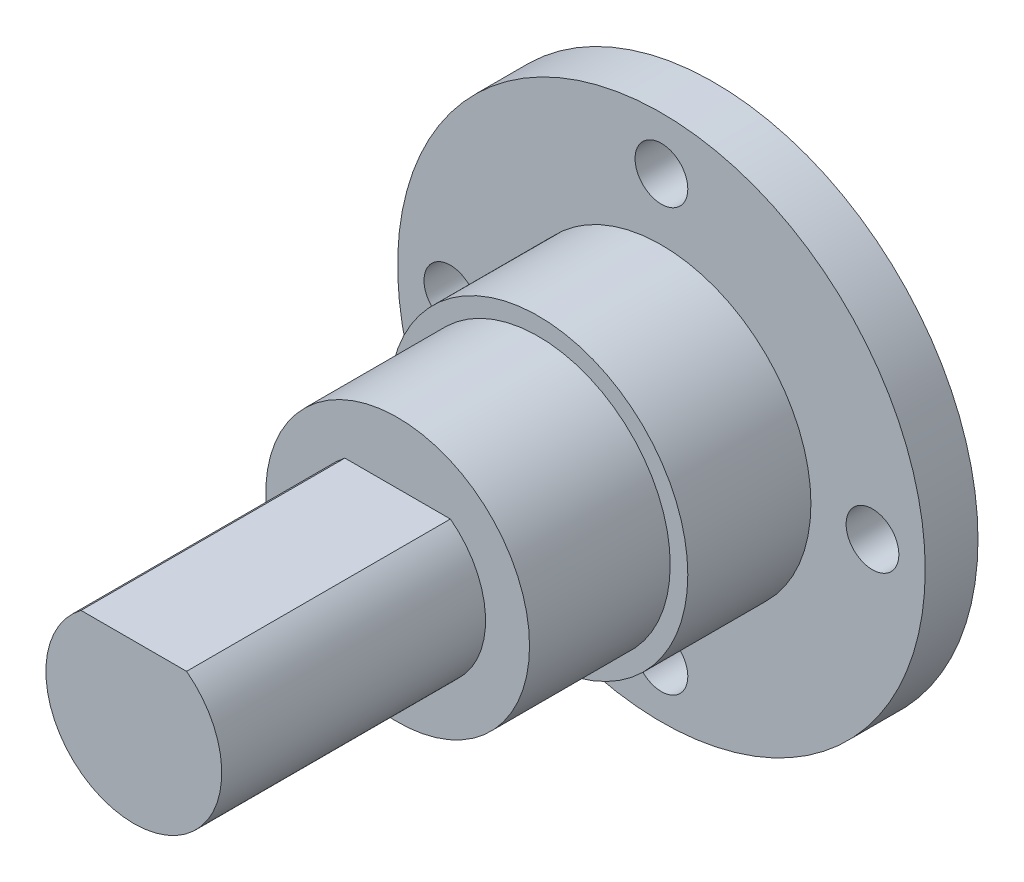
ISO-10303-21;
HEADER;
FILE_DESCRIPTION(('STEP AP214'),'2;1');
FILE_NAME('part.step','',(''),(''),'','','');
FILE_SCHEMA(('AUTOMOTIVE_DESIGN { 1 0 10303 214 1 1 1 1 }'));
ENDSEC;
DATA;
#1=APPLICATION_CONTEXT('core data for automotive mechanical design processes');
#2=APPLICATION_PROTOCOL_DEFINITION('international standard','automotive_design',2000,#1);
#3=PRODUCT_CONTEXT('',#1,'mechanical');
#4=PRODUCT('Part','Part','',(#3));
#5=PRODUCT_RELATED_PRODUCT_CATEGORY('part','',(#4));
#6=PRODUCT_DEFINITION_FORMATION('','',#4);
#7=PRODUCT_DEFINITION_CONTEXT('part definition',#1,'design');
#8=PRODUCT_DEFINITION('design','',#6,#7);
#9=PRODUCT_DEFINITION_SHAPE('','',#8);
#10=(LENGTH_UNIT() NAMED_UNIT(*) SI_UNIT(.MILLI.,.METRE.));
#11=(NAMED_UNIT(*) PLANE_ANGLE_UNIT() SI_UNIT($,.RADIAN.));
#12=(NAMED_UNIT(*) SI_UNIT($,.STERADIAN.) SOLID_ANGLE_UNIT());
#13=UNCERTAINTY_MEASURE_WITH_UNIT(LENGTH_MEASURE(1.E-05),#10,'distance_accuracy_value','');
#14=(GEOMETRIC_REPRESENTATION_CONTEXT(3) GLOBAL_UNCERTAINTY_ASSIGNED_CONTEXT((#13)) GLOBAL_UNIT_ASSIGNED_CONTEXT((#10,
#11,#12)) REPRESENTATION_CONTEXT('',''));
#15=CARTESIAN_POINT('',(0.,0.,0.));
#16=DIRECTION('',(0.,0.,1.));
#17=DIRECTION('',(1.,0.,0.));
#18=AXIS2_PLACEMENT_3D('',#15,#16,#17);
#19=CARTESIAN_POINT('',(0.,0.,18.));
#20=DIRECTION('',(0.,0.,-1.));
#21=DIRECTION('',(-1.,0.,0.));
#22=AXIS2_PLACEMENT_3D('',#19,#20,#21);
#23=CYLINDRICAL_SURFACE('',#22,7.5);
#24=CARTESIAN_POINT('',(0.,0.,10.));
#25=DIRECTION('',(0.,0.,1.));
#26=DIRECTION('',(1.,0.,0.));
#27=AXIS2_PLACEMENT_3D('',#24,#25,#26);
#28=CIRCLE('',#27,7.5);
#29=CARTESIAN_POINT('',(7.5,0.,10.));
#30=VERTEX_POINT('',#29);
#31=EDGE_CURVE('E41',#30,#30,#28,.T.);
#32=ORIENTED_EDGE('',*,*,#31,.T.);
#33=EDGE_LOOP('',(#32));
#34=FACE_BOUND('',#33,.T.);
#35=CARTESIAN_POINT('',(0.,0.,18.));
#36=DIRECTION('',(0.,0.,1.));
#37=DIRECTION('',(1.,0.,0.));
#38=AXIS2_PLACEMENT_3D('',#35,#36,#37);
#39=CIRCLE('',#38,7.5);
#40=CARTESIAN_POINT('',(7.5,0.,18.));
#41=VERTEX_POINT('',#40);
#42=EDGE_CURVE('E85',#41,#41,#39,.T.);
#43=ORIENTED_EDGE('',*,*,#42,.F.);
#44=EDGE_LOOP('',(#43));
#45=FACE_BOUND('',#44,.T.);
#46=ADVANCED_FACE('F37',(#34,#45),#23,.T.);
#47=CARTESIAN_POINT('',(0.,0.,18.));
#48=DIRECTION('',(0.,0.,1.));
#49=DIRECTION('',(1.,0.,0.));
#50=AXIS2_PLACEMENT_3D('',#47,#48,#49);
#51=PLANE('',#50);
#52=CARTESIAN_POINT('',(0.,0.,18.));
#53=DIRECTION('',(0.,0.,1.));
#54=DIRECTION('',(1.,0.,0.));
#55=AXIS2_PLACEMENT_3D('',#52,#53,#54);
#56=CIRCLE('',#55,5.);
#57=CARTESIAN_POINT('',(-3.,4.,18.));
#58=VERTEX_POINT('',#57);
#59=CARTESIAN_POINT('',(3.,4.,18.));
#60=VERTEX_POINT('',#59);
#61=EDGE_CURVE('E80',#58,#60,#56,.T.);
#62=ORIENTED_EDGE('',*,*,#61,.F.);
#63=DIRECTION('',(-1.,0.,0.));
#64=VECTOR('',#63,1.);
#65=CARTESIAN_POINT('',(-3.,4.,18.));
#66=LINE('',#65,#64);
#67=EDGE_CURVE('E53',#60,#58,#66,.T.);
#68=ORIENTED_EDGE('',*,*,#67,.F.);
#69=EDGE_LOOP('',(#62,#68));
#70=FACE_BOUND('',#69,.T.);
#71=ORIENTED_EDGE('',*,*,#42,.T.);
#72=EDGE_LOOP('',(#71));
#73=FACE_BOUND('',#72,.T.);
#74=ADVANCED_FACE('F129',(#70,#73),#51,.T.);
#75=CARTESIAN_POINT('',(0.,0.,33.));
#76=DIRECTION('',(0.,0.,1.));
#77=DIRECTION('',(1.,0.,0.));
#78=AXIS2_PLACEMENT_3D('',#75,#76,#77);
#79=PLANE('',#78);
#80=DIRECTION('',(1.,0.,0.));
#81=VECTOR('',#80,1.);
#82=CARTESIAN_POINT('',(-3.,4.,33.));
#83=LINE('',#82,#81);
#84=CARTESIAN_POINT('',(-3.,4.,33.));
#85=VERTEX_POINT('',#84);
#86=CARTESIAN_POINT('',(3.,4.,33.));
#87=VERTEX_POINT('',#86);
#88=EDGE_CURVE('E66',#85,#87,#83,.T.);
#89=ORIENTED_EDGE('',*,*,#88,.F.);
#90=CARTESIAN_POINT('',(0.,0.,33.));
#91=DIRECTION('',(0.,0.,1.));
#92=DIRECTION('',(1.,0.,0.));
#93=AXIS2_PLACEMENT_3D('',#90,#91,#92);
#94=CIRCLE('',#93,5.);
#95=EDGE_CURVE('E76',#85,#87,#94,.T.);
#96=ORIENTED_EDGE('',*,*,#95,.T.);
#97=EDGE_LOOP('',(#89,#96));
#98=FACE_BOUND('',#97,.T.);
#99=ADVANCED_FACE('F75',(#98),#79,.T.);
#100=CARTESIAN_POINT('',(0.,0.,33.));
#101=DIRECTION('',(0.,0.,-1.));
#102=DIRECTION('',(-1.,0.,0.));
#103=AXIS2_PLACEMENT_3D('',#100,#101,#102);
#104=CYLINDRICAL_SURFACE('',#103,5.);
#105=ORIENTED_EDGE('',*,*,#95,.F.);
#106=DIRECTION('',(0.,0.,1.));
#107=VECTOR('',#106,1.);
#108=CARTESIAN_POINT('',(-3.,4.,11.9172374697018));
#109=LINE('',#108,#107);
#110=EDGE_CURVE('E63',#58,#85,#109,.T.);
#111=ORIENTED_EDGE('',*,*,#110,.F.);
#112=ORIENTED_EDGE('',*,*,#61,.T.);
#113=DIRECTION('',(0.,0.,1.));
#114=VECTOR('',#113,1.);
#115=CARTESIAN_POINT('',(3.,4.,11.9172374697018));
#116=LINE('',#115,#114);
#117=EDGE_CURVE('E71',#60,#87,#116,.T.);
#118=ORIENTED_EDGE('',*,*,#117,.T.);
#119=EDGE_LOOP('',(#105,#111,#112,#118));
#120=FACE_BOUND('',#119,.T.);
#121=ADVANCED_FACE('F78',(#120),#104,.T.);
#122=CARTESIAN_POINT('',(-3.,4.,11.9172374697018));
#123=DIRECTION('',(0.,-1.,0.));
#124=DIRECTION('',(0.,0.,-1.));
#125=AXIS2_PLACEMENT_3D('',#122,#123,#124);
#126=PLANE('',#125);
#127=ORIENTED_EDGE('',*,*,#67,.T.);
#128=ORIENTED_EDGE('',*,*,#110,.T.);
#129=ORIENTED_EDGE('',*,*,#88,.T.);
#130=ORIENTED_EDGE('',*,*,#117,.F.);
#131=EDGE_LOOP('',(#127,#128,#129,#130));
#132=FACE_BOUND('',#131,.T.);
#133=ADVANCED_FACE('F65',(#132),#126,.F.);
#134=CARTESIAN_POINT('',(0.,0.,10.));
#135=DIRECTION('',(0.,0.,-1.));
#136=DIRECTION('',(-1.,0.,0.));
#137=AXIS2_PLACEMENT_3D('',#134,#135,#136);
#138=CYLINDRICAL_SURFACE('',#137,8.5);
#139=CARTESIAN_POINT('',(0.,0.,10.));
#140=DIRECTION('',(0.,0.,1.));
#141=DIRECTION('',(1.,0.,0.));
#142=AXIS2_PLACEMENT_3D('',#139,#140,#141);
#143=CIRCLE('',#142,8.5);
#144=CARTESIAN_POINT('',(8.5,0.,10.));
#145=VERTEX_POINT('',#144);
#146=EDGE_CURVE('E181',#145,#145,#143,.T.);
#147=ORIENTED_EDGE('',*,*,#146,.F.);
#148=EDGE_LOOP('',(#147));
#149=FACE_BOUND('',#148,.T.);
#150=CARTESIAN_POINT('',(0.,0.,3.));
#151=DIRECTION('',(0.,0.,1.));
#152=DIRECTION('',(1.,0.,0.));
#153=AXIS2_PLACEMENT_3D('',#150,#151,#152);
#154=CIRCLE('',#153,8.5);
#155=CARTESIAN_POINT('',(8.5,0.,3.));
#156=VERTEX_POINT('',#155);
#157=EDGE_CURVE('E166',#156,#156,#154,.T.);
#158=ORIENTED_EDGE('',*,*,#157,.T.);
#159=EDGE_LOOP('',(#158));
#160=FACE_BOUND('',#159,.T.);
#161=ADVANCED_FACE('F123',(#149,#160),#138,.T.);
#162=CARTESIAN_POINT('',(0.,0.,10.));
#163=DIRECTION('',(0.,0.,1.));
#164=DIRECTION('',(1.,0.,0.));
#165=AXIS2_PLACEMENT_3D('',#162,#163,#164);
#166=PLANE('',#165);
#167=ORIENTED_EDGE('',*,*,#31,.F.);
#168=EDGE_LOOP('',(#167));
#169=FACE_BOUND('',#168,.T.);
#170=ORIENTED_EDGE('',*,*,#146,.T.);
#171=EDGE_LOOP('',(#170));
#172=FACE_BOUND('',#171,.T.);
#173=ADVANCED_FACE('F115',(#169,#172),#166,.T.);
#174=CARTESIAN_POINT('',(0.,0.,0.));
#175=DIRECTION('',(0.,0.,1.));
#176=DIRECTION('',(1.,0.,0.));
#177=AXIS2_PLACEMENT_3D('',#174,#175,#176);
#178=PLANE('',#177);
#179=CARTESIAN_POINT('',(0.,12.,0.));
#180=DIRECTION('',(0.,0.,1.));
#181=DIRECTION('',(1.,0.,0.));
#182=AXIS2_PLACEMENT_3D('',#179,#180,#181);
#183=CIRCLE('',#182,1.5);
#184=CARTESIAN_POINT('',(1.5,12.,0.));
#185=VERTEX_POINT('',#184);
#186=EDGE_CURVE('E89',#185,#185,#183,.T.);
#187=ORIENTED_EDGE('',*,*,#186,.T.);
#188=EDGE_LOOP('',(#187));
#189=FACE_BOUND('',#188,.T.);
#190=CARTESIAN_POINT('',(12.0000000000002,2.26149028644085E-13,0.));
#191=DIRECTION('',(0.,0.,1.));
#192=DIRECTION('',(1.,0.,0.));
#193=AXIS2_PLACEMENT_3D('',#190,#191,#192);
#194=CIRCLE('',#193,1.5);
#195=CARTESIAN_POINT('',(13.5000000000002,2.26149028644085E-13,0.));
#196=VERTEX_POINT('',#195);
#197=EDGE_CURVE('E95',#196,#196,#194,.T.);
#198=ORIENTED_EDGE('',*,*,#197,.T.);
#199=EDGE_LOOP('',(#198));
#200=FACE_BOUND('',#199,.T.);
#201=CARTESIAN_POINT('',(4.52298057288169E-13,-12.,0.));
#202=DIRECTION('',(0.,0.,1.));
#203=DIRECTION('',(1.,0.,0.));
#204=AXIS2_PLACEMENT_3D('',#201,#202,#203);
#205=CIRCLE('',#204,1.5);
#206=CARTESIAN_POINT('',(1.50000000000045,-12.,0.));
#207=VERTEX_POINT('',#206);
#208=EDGE_CURVE('E101',#207,#207,#205,.T.);
#209=ORIENTED_EDGE('',*,*,#208,.T.);
#210=EDGE_LOOP('',(#209));
#211=FACE_BOUND('',#210,.T.);
#212=CARTESIAN_POINT('',(-11.9999999999998,-2.27618604803062E-13,0.));
#213=DIRECTION('',(0.,0.,1.));
#214=DIRECTION('',(1.,0.,0.));
#215=AXIS2_PLACEMENT_3D('',#212,#213,#214);
#216=CIRCLE('',#215,1.5);
#217=CARTESIAN_POINT('',(-10.4999999999998,-2.27618604803062E-13,0.));
#218=VERTEX_POINT('',#217);
#219=EDGE_CURVE('E83',#218,#218,#216,.T.);
#220=ORIENTED_EDGE('',*,*,#219,.T.);
#221=EDGE_LOOP('',(#220));
#222=FACE_BOUND('',#221,.T.);
#223=CARTESIAN_POINT('',(0.,0.,0.));
#224=DIRECTION('',(0.,0.,1.));
#225=DIRECTION('',(1.,0.,0.));
#226=AXIS2_PLACEMENT_3D('',#223,#224,#225);
#227=CIRCLE('',#226,15.);
#228=CARTESIAN_POINT('',(15.,0.,0.));
#229=VERTEX_POINT('',#228);
#230=EDGE_CURVE('E46',#229,#229,#227,.T.);
#231=ORIENTED_EDGE('',*,*,#230,.F.);
#232=EDGE_LOOP('',(#231));
#233=FACE_BOUND('',#232,.T.);
#234=ADVANCED_FACE('F113',(#189,#200,#211,#222,#233),#178,.F.);
#235=CARTESIAN_POINT('',(0.,0.,3.));
#236=DIRECTION('',(0.,0.,-1.));
#237=DIRECTION('',(-1.,0.,0.));
#238=AXIS2_PLACEMENT_3D('',#235,#236,#237);
#239=CYLINDRICAL_SURFACE('',#238,15.);
#240=CARTESIAN_POINT('',(0.,0.,3.));
#241=DIRECTION('',(0.,0.,1.));
#242=DIRECTION('',(1.,0.,0.));
#243=AXIS2_PLACEMENT_3D('',#240,#241,#242);
#244=CIRCLE('',#243,15.);
#245=CARTESIAN_POINT('',(15.,0.,3.));
#246=VERTEX_POINT('',#245);
#247=EDGE_CURVE('E11',#246,#246,#244,.T.);
#248=ORIENTED_EDGE('',*,*,#247,.F.);
#249=EDGE_LOOP('',(#248));
#250=FACE_BOUND('',#249,.T.);
#251=ORIENTED_EDGE('',*,*,#230,.T.);
#252=EDGE_LOOP('',(#251));
#253=FACE_BOUND('',#252,.T.);
#254=ADVANCED_FACE('F39',(#250,#253),#239,.T.);
#255=CARTESIAN_POINT('',(-11.9999999999998,-2.27618604803062E-13,0.));
#256=DIRECTION('',(0.,0.,1.));
#257=DIRECTION('',(1.,0.,0.));
#258=AXIS2_PLACEMENT_3D('',#255,#256,#257);
#259=CYLINDRICAL_SURFACE('',#258,1.5);
#260=ORIENTED_EDGE('',*,*,#219,.F.);
#261=EDGE_LOOP('',(#260));
#262=FACE_BOUND('',#261,.T.);
#263=CARTESIAN_POINT('',(-11.9999999999998,-2.27618604803062E-13,3.));
#264=DIRECTION('',(0.,0.,1.));
#265=DIRECTION('',(1.,0.,0.));
#266=AXIS2_PLACEMENT_3D('',#263,#264,#265);
#267=CIRCLE('',#266,1.5);
#268=CARTESIAN_POINT('',(-10.4999999999998,-2.27618604803062E-13,3.));
#269=VERTEX_POINT('',#268);
#270=EDGE_CURVE('E79',#269,#269,#267,.T.);
#271=ORIENTED_EDGE('',*,*,#270,.T.);
#272=EDGE_LOOP('',(#271));
#273=FACE_BOUND('',#272,.T.);
#274=ADVANCED_FACE('F121',(#262,#273),#259,.F.);
#275=CARTESIAN_POINT('',(4.52298057288169E-13,-12.,0.));
#276=DIRECTION('',(0.,0.,1.));
#277=DIRECTION('',(1.,0.,0.));
#278=AXIS2_PLACEMENT_3D('',#275,#276,#277);
#279=CYLINDRICAL_SURFACE('',#278,1.5);
#280=ORIENTED_EDGE('',*,*,#208,.F.);
#281=EDGE_LOOP('',(#280));
#282=FACE_BOUND('',#281,.T.);
#283=CARTESIAN_POINT('',(4.52298057288169E-13,-12.,3.));
#284=DIRECTION('',(0.,0.,1.));
#285=DIRECTION('',(1.,0.,0.));
#286=AXIS2_PLACEMENT_3D('',#283,#284,#285);
#287=CIRCLE('',#286,1.5);
#288=CARTESIAN_POINT('',(1.50000000000045,-12.,3.));
#289=VERTEX_POINT('',#288);
#290=EDGE_CURVE('E104',#289,#289,#287,.T.);
#291=ORIENTED_EDGE('',*,*,#290,.T.);
#292=EDGE_LOOP('',(#291));
#293=FACE_BOUND('',#292,.T.);
#294=ADVANCED_FACE('F152',(#282,#293),#279,.F.);
#295=CARTESIAN_POINT('',(12.0000000000002,2.26149028644085E-13,0.));
#296=DIRECTION('',(0.,0.,1.));
#297=DIRECTION('',(1.,0.,0.));
#298=AXIS2_PLACEMENT_3D('',#295,#296,#297);
#299=CYLINDRICAL_SURFACE('',#298,1.5);
#300=ORIENTED_EDGE('',*,*,#197,.F.);
#301=EDGE_LOOP('',(#300));
#302=FACE_BOUND('',#301,.T.);
#303=CARTESIAN_POINT('',(12.0000000000002,2.26149028644085E-13,3.));
#304=DIRECTION('',(0.,0.,1.));
#305=DIRECTION('',(1.,0.,0.));
#306=AXIS2_PLACEMENT_3D('',#303,#304,#305);
#307=CIRCLE('',#306,1.5);
#308=CARTESIAN_POINT('',(13.5000000000002,2.26149028644085E-13,3.));
#309=VERTEX_POINT('',#308);
#310=EDGE_CURVE('E98',#309,#309,#307,.T.);
#311=ORIENTED_EDGE('',*,*,#310,.T.);
#312=EDGE_LOOP('',(#311));
#313=FACE_BOUND('',#312,.T.);
#314=ADVANCED_FACE('F148',(#302,#313),#299,.F.);
#315=CARTESIAN_POINT('',(0.,12.,0.));
#316=DIRECTION('',(0.,0.,1.));
#317=DIRECTION('',(1.,0.,0.));
#318=AXIS2_PLACEMENT_3D('',#315,#316,#317);
#319=CYLINDRICAL_SURFACE('',#318,1.5);
#320=ORIENTED_EDGE('',*,*,#186,.F.);
#321=EDGE_LOOP('',(#320));
#322=FACE_BOUND('',#321,.T.);
#323=CARTESIAN_POINT('',(0.,12.,3.));
#324=DIRECTION('',(0.,0.,1.));
#325=DIRECTION('',(1.,0.,0.));
#326=AXIS2_PLACEMENT_3D('',#323,#324,#325);
#327=CIRCLE('',#326,1.5);
#328=CARTESIAN_POINT('',(1.5,12.,3.));
#329=VERTEX_POINT('',#328);
#330=EDGE_CURVE('E92',#329,#329,#327,.T.);
#331=ORIENTED_EDGE('',*,*,#330,.T.);
#332=EDGE_LOOP('',(#331));
#333=FACE_BOUND('',#332,.T.);
#334=ADVANCED_FACE('F144',(#322,#333),#319,.F.);
#335=CARTESIAN_POINT('',(0.,0.,3.));
#336=DIRECTION('',(0.,0.,1.));
#337=DIRECTION('',(1.,0.,0.));
#338=AXIS2_PLACEMENT_3D('',#335,#336,#337);
#339=PLANE('',#338);
#340=ORIENTED_EDGE('',*,*,#157,.F.);
#341=EDGE_LOOP('',(#340));
#342=FACE_BOUND('',#341,.T.);
#343=ORIENTED_EDGE('',*,*,#330,.F.);
#344=EDGE_LOOP('',(#343));
#345=FACE_BOUND('',#344,.T.);
#346=ORIENTED_EDGE('',*,*,#310,.F.);
#347=EDGE_LOOP('',(#346));
#348=FACE_BOUND('',#347,.T.);
#349=ORIENTED_EDGE('',*,*,#290,.F.);
#350=EDGE_LOOP('',(#349));
#351=FACE_BOUND('',#350,.T.);
#352=ORIENTED_EDGE('',*,*,#270,.F.);
#353=EDGE_LOOP('',(#352));
#354=FACE_BOUND('',#353,.T.);
#355=ORIENTED_EDGE('',*,*,#247,.T.);
#356=EDGE_LOOP('',(#355));
#357=FACE_BOUND('',#356,.T.);
#358=ADVANCED_FACE('F147',(#342,#345,#348,#351,#354,#357),#339,.T.);
#359=CLOSED_SHELL('',(#46,#74,#99,#121,#133,#161,#173,#234,#254,#274,#294,#314,#334,#358));
#360=MANIFOLD_SOLID_BREP('B2',#359);
#361=ADVANCED_BREP_SHAPE_REPRESENTATION('',(#18,#360),#14);
#362=SHAPE_DEFINITION_REPRESENTATION(#9,#361);
ENDSEC;
END-ISO-10303-21;
